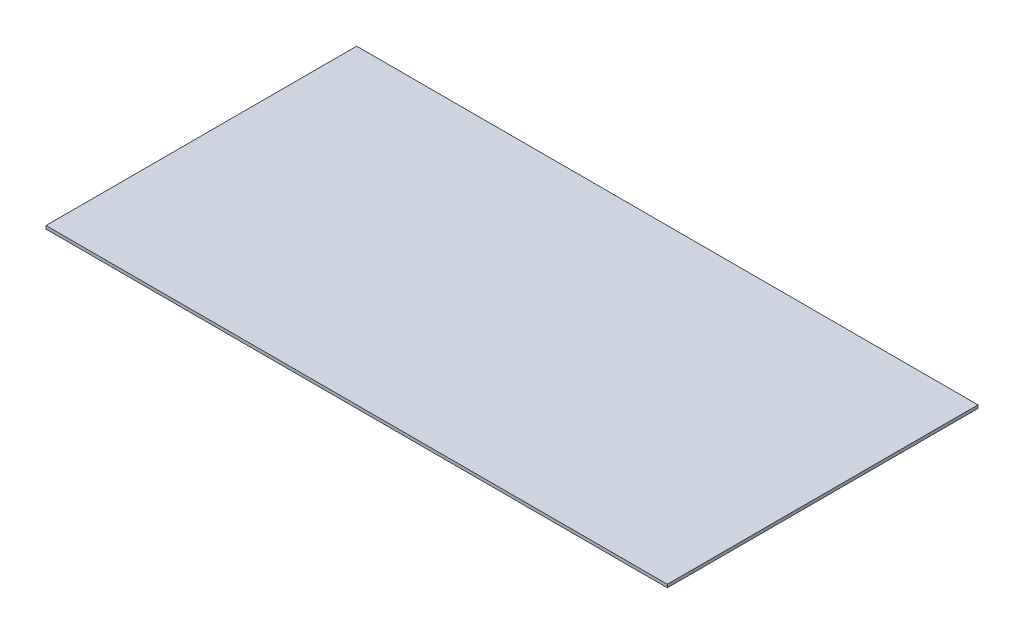
ISO-10303-21;
HEADER;
FILE_DESCRIPTION(('STEP AP214'),'2;1');
FILE_NAME('part.step','',(''),(''),'','','');
FILE_SCHEMA(('AUTOMOTIVE_DESIGN { 1 0 10303 214 1 1 1 1 }'));
ENDSEC;
DATA;
#1=APPLICATION_CONTEXT('core data for automotive mechanical design processes');
#2=APPLICATION_PROTOCOL_DEFINITION('international standard','automotive_design',2000,#1);
#3=PRODUCT_CONTEXT('',#1,'mechanical');
#4=PRODUCT('Part','Part','',(#3));
#5=PRODUCT_RELATED_PRODUCT_CATEGORY('part','',(#4));
#6=PRODUCT_DEFINITION_FORMATION('','',#4);
#7=PRODUCT_DEFINITION_CONTEXT('part definition',#1,'design');
#8=PRODUCT_DEFINITION('design','',#6,#7);
#9=PRODUCT_DEFINITION_SHAPE('','',#8);
#10=(LENGTH_UNIT() NAMED_UNIT(*) SI_UNIT(.MILLI.,.METRE.));
#11=(NAMED_UNIT(*) PLANE_ANGLE_UNIT() SI_UNIT($,.RADIAN.));
#12=(NAMED_UNIT(*) SI_UNIT($,.STERADIAN.) SOLID_ANGLE_UNIT());
#13=UNCERTAINTY_MEASURE_WITH_UNIT(LENGTH_MEASURE(1.E-05),#10,'distance_accuracy_value','');
#14=(GEOMETRIC_REPRESENTATION_CONTEXT(3) GLOBAL_UNCERTAINTY_ASSIGNED_CONTEXT((#13)) GLOBAL_UNIT_ASSIGNED_CONTEXT((#10,
#11,#12)) REPRESENTATION_CONTEXT('',''));
#15=CARTESIAN_POINT('',(0.,0.,0.));
#16=DIRECTION('',(0.,0.,1.));
#17=DIRECTION('',(1.,0.,0.));
#18=AXIS2_PLACEMENT_3D('',#15,#16,#17);
#19=CARTESIAN_POINT('',(20.,0.2,-10.));
#20=DIRECTION('',(-1.,0.,0.));
#21=DIRECTION('',(0.,0.,1.));
#22=AXIS2_PLACEMENT_3D('',#19,#20,#21);
#23=PLANE('',#22);
#24=DIRECTION('',(0.,0.,-1.));
#25=VECTOR('',#24,1.);
#26=CARTESIAN_POINT('',(20.,0.,-10.));
#27=LINE('',#26,#25);
#28=CARTESIAN_POINT('',(20.,0.,10.));
#29=VERTEX_POINT('',#28);
#30=CARTESIAN_POINT('',(20.,0.,-10.));
#31=VERTEX_POINT('',#30);
#32=EDGE_CURVE('E96',#29,#31,#27,.T.);
#33=ORIENTED_EDGE('',*,*,#32,.T.);
#34=DIRECTION('',(0.,-1.,0.));
#35=VECTOR('',#34,1.);
#36=CARTESIAN_POINT('',(20.,0.2,-10.));
#37=LINE('',#36,#35);
#38=CARTESIAN_POINT('',(20.,0.2,-10.));
#39=VERTEX_POINT('',#38);
#40=EDGE_CURVE('E11',#39,#31,#37,.T.);
#41=ORIENTED_EDGE('',*,*,#40,.F.);
#42=DIRECTION('',(0.,0.,-1.));
#43=VECTOR('',#42,1.);
#44=CARTESIAN_POINT('',(20.,0.2,-10.));
#45=LINE('',#44,#43);
#46=CARTESIAN_POINT('',(20.,0.2,10.));
#47=VERTEX_POINT('',#46);
#48=EDGE_CURVE('E84',#47,#39,#45,.T.);
#49=ORIENTED_EDGE('',*,*,#48,.F.);
#50=DIRECTION('',(0.,-1.,0.));
#51=VECTOR('',#50,1.);
#52=CARTESIAN_POINT('',(20.,0.2,10.));
#53=LINE('',#52,#51);
#54=EDGE_CURVE('E92',#47,#29,#53,.T.);
#55=ORIENTED_EDGE('',*,*,#54,.T.);
#56=EDGE_LOOP('',(#33,#41,#49,#55));
#57=FACE_BOUND('',#56,.T.);
#58=ADVANCED_FACE('F33',(#57),#23,.F.);
#59=CARTESIAN_POINT('',(-20.,0.2,-10.));
#60=DIRECTION('',(0.,0.,1.));
#61=DIRECTION('',(1.,0.,0.));
#62=AXIS2_PLACEMENT_3D('',#59,#60,#61);
#63=PLANE('',#62);
#64=DIRECTION('',(-1.,0.,0.));
#65=VECTOR('',#64,1.);
#66=CARTESIAN_POINT('',(-20.,0.,-10.));
#67=LINE('',#66,#65);
#68=CARTESIAN_POINT('',(-20.,0.,-10.));
#69=VERTEX_POINT('',#68);
#70=EDGE_CURVE('E88',#31,#69,#67,.T.);
#71=ORIENTED_EDGE('',*,*,#70,.T.);
#72=DIRECTION('',(0.,-1.,0.));
#73=VECTOR('',#72,1.);
#74=CARTESIAN_POINT('',(-20.,0.2,-10.));
#75=LINE('',#74,#73);
#76=CARTESIAN_POINT('',(-20.,0.2,-10.));
#77=VERTEX_POINT('',#76);
#78=EDGE_CURVE('E41',#77,#69,#75,.T.);
#79=ORIENTED_EDGE('',*,*,#78,.F.);
#80=DIRECTION('',(-1.,0.,0.));
#81=VECTOR('',#80,1.);
#82=CARTESIAN_POINT('',(-20.,0.2,-10.));
#83=LINE('',#82,#81);
#84=EDGE_CURVE('E79',#39,#77,#83,.T.);
#85=ORIENTED_EDGE('',*,*,#84,.F.);
#86=ORIENTED_EDGE('',*,*,#40,.T.);
#87=EDGE_LOOP('',(#71,#79,#85,#86));
#88=FACE_BOUND('',#87,.T.);
#89=ADVANCED_FACE('F87',(#88),#63,.F.);
#90=CARTESIAN_POINT('',(-20.,0.2,-10.));
#91=DIRECTION('',(1.,0.,0.));
#92=DIRECTION('',(0.,0.,-1.));
#93=AXIS2_PLACEMENT_3D('',#90,#91,#92);
#94=PLANE('',#93);
#95=DIRECTION('',(0.,0.,1.));
#96=VECTOR('',#95,1.);
#97=CARTESIAN_POINT('',(-20.,0.,-10.));
#98=LINE('',#97,#96);
#99=CARTESIAN_POINT('',(-20.,0.,10.));
#100=VERTEX_POINT('',#99);
#101=EDGE_CURVE('E66',#69,#100,#98,.T.);
#102=ORIENTED_EDGE('',*,*,#101,.T.);
#103=DIRECTION('',(0.,-1.,0.));
#104=VECTOR('',#103,1.);
#105=CARTESIAN_POINT('',(-20.,0.2,10.));
#106=LINE('',#105,#104);
#107=CARTESIAN_POINT('',(-20.,0.2,10.));
#108=VERTEX_POINT('',#107);
#109=EDGE_CURVE('E89',#108,#100,#106,.T.);
#110=ORIENTED_EDGE('',*,*,#109,.F.);
#111=DIRECTION('',(0.,0.,1.));
#112=VECTOR('',#111,1.);
#113=CARTESIAN_POINT('',(-20.,0.2,-10.));
#114=LINE('',#113,#112);
#115=EDGE_CURVE('E82',#77,#108,#114,.T.);
#116=ORIENTED_EDGE('',*,*,#115,.F.);
#117=ORIENTED_EDGE('',*,*,#78,.T.);
#118=EDGE_LOOP('',(#102,#110,#116,#117));
#119=FACE_BOUND('',#118,.T.);
#120=ADVANCED_FACE('F90',(#119),#94,.F.);
#121=CARTESIAN_POINT('',(-20.,0.2,10.));
#122=DIRECTION('',(0.,0.,-1.));
#123=DIRECTION('',(-1.,0.,0.));
#124=AXIS2_PLACEMENT_3D('',#121,#122,#123);
#125=PLANE('',#124);
#126=DIRECTION('',(1.,0.,0.));
#127=VECTOR('',#126,1.);
#128=CARTESIAN_POINT('',(-20.,0.,10.));
#129=LINE('',#128,#127);
#130=EDGE_CURVE('E72',#100,#29,#129,.T.);
#131=ORIENTED_EDGE('',*,*,#130,.T.);
#132=ORIENTED_EDGE('',*,*,#54,.F.);
#133=DIRECTION('',(1.,0.,0.));
#134=VECTOR('',#133,1.);
#135=CARTESIAN_POINT('',(-20.,0.2,10.));
#136=LINE('',#135,#134);
#137=EDGE_CURVE('E49',#108,#47,#136,.T.);
#138=ORIENTED_EDGE('',*,*,#137,.F.);
#139=ORIENTED_EDGE('',*,*,#109,.T.);
#140=EDGE_LOOP('',(#131,#132,#138,#139));
#141=FACE_BOUND('',#140,.T.);
#142=ADVANCED_FACE('F103',(#141),#125,.F.);
#143=CARTESIAN_POINT('',(0.,0.2,0.));
#144=DIRECTION('',(0.,1.,0.));
#145=DIRECTION('',(0.,0.,1.));
#146=AXIS2_PLACEMENT_3D('',#143,#144,#145);
#147=PLANE('',#146);
#148=ORIENTED_EDGE('',*,*,#48,.T.);
#149=ORIENTED_EDGE('',*,*,#84,.T.);
#150=ORIENTED_EDGE('',*,*,#115,.T.);
#151=ORIENTED_EDGE('',*,*,#137,.T.);
#152=EDGE_LOOP('',(#148,#149,#150,#151));
#153=FACE_BOUND('',#152,.T.);
#154=ADVANCED_FACE('F80',(#153),#147,.T.);
#155=CARTESIAN_POINT('',(0.,0.,0.));
#156=DIRECTION('',(0.,1.,0.));
#157=DIRECTION('',(0.,0.,1.));
#158=AXIS2_PLACEMENT_3D('',#155,#156,#157);
#159=PLANE('',#158);
#160=ORIENTED_EDGE('',*,*,#32,.F.);
#161=ORIENTED_EDGE('',*,*,#130,.F.);
#162=ORIENTED_EDGE('',*,*,#101,.F.);
#163=ORIENTED_EDGE('',*,*,#70,.F.);
#164=EDGE_LOOP('',(#160,#161,#162,#163));
#165=FACE_BOUND('',#164,.T.);
#166=ADVANCED_FACE('F106',(#165),#159,.F.);
#167=CLOSED_SHELL('',(#58,#89,#120,#142,#154,#166));
#168=MANIFOLD_SOLID_BREP('B2',#167);
#169=ADVANCED_BREP_SHAPE_REPRESENTATION('',(#18,#168),#14);
#170=SHAPE_DEFINITION_REPRESENTATION(#9,#169);
ENDSEC;
END-ISO-10303-21;
